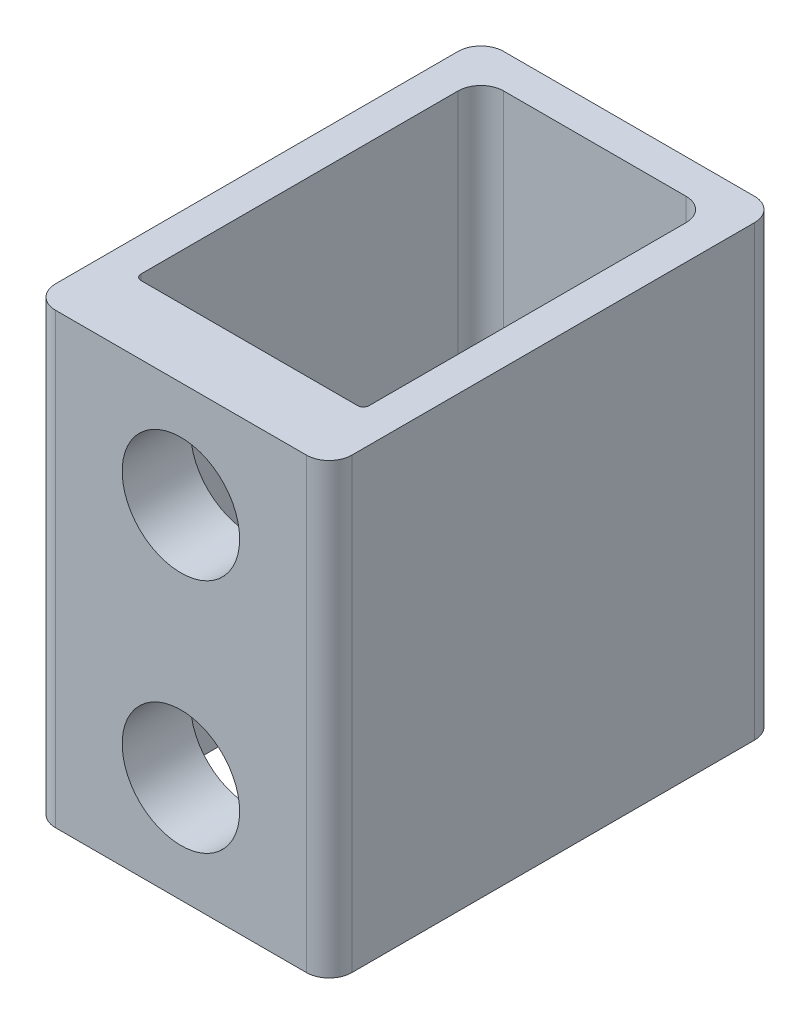
ISO-10303-21;
HEADER;
FILE_DESCRIPTION(('STEP AP214'),'2;1');
FILE_NAME('part.step','',(''),(''),'','','');
FILE_SCHEMA(('AUTOMOTIVE_DESIGN { 1 0 10303 214 1 1 1 1 }'));
ENDSEC;
DATA;
#1=APPLICATION_CONTEXT('core data for automotive mechanical design processes');
#2=APPLICATION_PROTOCOL_DEFINITION('international standard','automotive_design',2000,#1);
#3=PRODUCT_CONTEXT('',#1,'mechanical');
#4=PRODUCT('Part','Part','',(#3));
#5=PRODUCT_RELATED_PRODUCT_CATEGORY('part','',(#4));
#6=PRODUCT_DEFINITION_FORMATION('','',#4);
#7=PRODUCT_DEFINITION_CONTEXT('part definition',#1,'design');
#8=PRODUCT_DEFINITION('design','',#6,#7);
#9=PRODUCT_DEFINITION_SHAPE('','',#8);
#10=(LENGTH_UNIT() NAMED_UNIT(*) SI_UNIT(.MILLI.,.METRE.));
#11=(NAMED_UNIT(*) PLANE_ANGLE_UNIT() SI_UNIT($,.RADIAN.));
#12=(NAMED_UNIT(*) SI_UNIT($,.STERADIAN.) SOLID_ANGLE_UNIT());
#13=UNCERTAINTY_MEASURE_WITH_UNIT(LENGTH_MEASURE(1.E-05),#10,'distance_accuracy_value','');
#14=(GEOMETRIC_REPRESENTATION_CONTEXT(3) GLOBAL_UNCERTAINTY_ASSIGNED_CONTEXT((#13)) GLOBAL_UNIT_ASSIGNED_CONTEXT((#10,
#11,#12)) REPRESENTATION_CONTEXT('',''));
#15=CARTESIAN_POINT('',(0.,0.,0.));
#16=DIRECTION('',(0.,0.,1.));
#17=DIRECTION('',(1.,0.,0.));
#18=AXIS2_PLACEMENT_3D('',#15,#16,#17);
#19=CARTESIAN_POINT('',(5.5,-19.65,-8.825));
#20=DIRECTION('',(0.,1.,0.));
#21=DIRECTION('',(0.,0.,1.));
#22=AXIS2_PLACEMENT_3D('',#19,#20,#21);
#23=CYLINDRICAL_SURFACE('',#22,1.);
#24=CARTESIAN_POINT('',(5.5,0.,-8.825));
#25=DIRECTION('',(0.,1.,0.));
#26=DIRECTION('',(0.,0.,-1.));
#27=AXIS2_PLACEMENT_3D('',#24,#25,#26);
#28=CIRCLE('',#27,1.);
#29=CARTESIAN_POINT('',(6.5,0.,-8.82499999999999));
#30=VERTEX_POINT('',#29);
#31=CARTESIAN_POINT('',(5.49999999999999,0.,-9.825));
#32=VERTEX_POINT('',#31);
#33=EDGE_CURVE('E231',#30,#32,#28,.T.);
#34=ORIENTED_EDGE('',*,*,#33,.F.);
#35=DIRECTION('',(0.,1.,0.));
#36=VECTOR('',#35,1.);
#37=CARTESIAN_POINT('',(6.5,-19.65,-8.82499999999999));
#38=LINE('',#37,#36);
#39=CARTESIAN_POINT('',(6.5,-19.65,-8.82499999999999));
#40=VERTEX_POINT('',#39);
#41=EDGE_CURVE('E11',#40,#30,#38,.T.);
#42=ORIENTED_EDGE('',*,*,#41,.F.);
#43=CARTESIAN_POINT('',(5.5,-19.65,-8.825));
#44=DIRECTION('',(0.,1.,0.));
#45=DIRECTION('',(0.,0.,-1.));
#46=AXIS2_PLACEMENT_3D('',#43,#44,#45);
#47=CIRCLE('',#46,1.);
#48=CARTESIAN_POINT('',(5.49999999999999,-19.65,-9.825));
#49=VERTEX_POINT('',#48);
#50=EDGE_CURVE('E249',#40,#49,#47,.T.);
#51=ORIENTED_EDGE('',*,*,#50,.T.);
#52=DIRECTION('',(0.,1.,0.));
#53=VECTOR('',#52,1.);
#54=CARTESIAN_POINT('',(5.49999999999999,-19.65,-9.825));
#55=LINE('',#54,#53);
#56=EDGE_CURVE('E282',#49,#32,#55,.T.);
#57=ORIENTED_EDGE('',*,*,#56,.T.);
#58=EDGE_LOOP('',(#34,#42,#51,#57));
#59=FACE_BOUND('',#58,.T.);
#60=ADVANCED_FACE('F39',(#59),#23,.T.);
#61=CARTESIAN_POINT('',(6.5,-19.65,-8.82499999999999));
#62=DIRECTION('',(1.,0.,0.));
#63=DIRECTION('',(0.,0.,-1.));
#64=AXIS2_PLACEMENT_3D('',#61,#62,#63);
#65=PLANE('',#64);
#66=DIRECTION('',(0.,0.,-1.));
#67=VECTOR('',#66,1.);
#68=CARTESIAN_POINT('',(6.5,0.,-8.82499999999999));
#69=LINE('',#68,#67);
#70=CARTESIAN_POINT('',(6.5,0.,8.82499999999999));
#71=VERTEX_POINT('',#70);
#72=EDGE_CURVE('E254',#71,#30,#69,.T.);
#73=ORIENTED_EDGE('',*,*,#72,.F.);
#74=DIRECTION('',(0.,1.,0.));
#75=VECTOR('',#74,1.);
#76=CARTESIAN_POINT('',(6.5,-19.65,8.82499999999999));
#77=LINE('',#76,#75);
#78=CARTESIAN_POINT('',(6.5,-19.65,8.82499999999999));
#79=VERTEX_POINT('',#78);
#80=EDGE_CURVE('E48',#79,#71,#77,.T.);
#81=ORIENTED_EDGE('',*,*,#80,.F.);
#82=DIRECTION('',(0.,0.,-1.));
#83=VECTOR('',#82,1.);
#84=CARTESIAN_POINT('',(6.5,-19.65,-8.82499999999999));
#85=LINE('',#84,#83);
#86=EDGE_CURVE('E278',#79,#40,#85,.T.);
#87=ORIENTED_EDGE('',*,*,#86,.T.);
#88=ORIENTED_EDGE('',*,*,#41,.T.);
#89=EDGE_LOOP('',(#73,#81,#87,#88));
#90=FACE_BOUND('',#89,.T.);
#91=ADVANCED_FACE('F384',(#90),#65,.T.);
#92=CARTESIAN_POINT('',(5.5,-19.65,8.825));
#93=DIRECTION('',(0.,1.,0.));
#94=DIRECTION('',(0.,0.,1.));
#95=AXIS2_PLACEMENT_3D('',#92,#93,#94);
#96=CYLINDRICAL_SURFACE('',#95,1.);
#97=CARTESIAN_POINT('',(5.5,0.,8.825));
#98=DIRECTION('',(0.,1.,0.));
#99=DIRECTION('',(0.,0.,1.));
#100=AXIS2_PLACEMENT_3D('',#97,#98,#99);
#101=CIRCLE('',#100,1.);
#102=CARTESIAN_POINT('',(5.5,0.,9.825));
#103=VERTEX_POINT('',#102);
#104=EDGE_CURVE('E306',#103,#71,#101,.T.);
#105=ORIENTED_EDGE('',*,*,#104,.F.);
#106=DIRECTION('',(0.,1.,0.));
#107=VECTOR('',#106,1.);
#108=CARTESIAN_POINT('',(5.5,-19.65,9.825));
#109=LINE('',#108,#107);
#110=CARTESIAN_POINT('',(5.5,-19.65,9.825));
#111=VERTEX_POINT('',#110);
#112=EDGE_CURVE('E315',#111,#103,#109,.T.);
#113=ORIENTED_EDGE('',*,*,#112,.F.);
#114=CARTESIAN_POINT('',(5.5,-19.65,8.825));
#115=DIRECTION('',(0.,1.,0.));
#116=DIRECTION('',(0.,0.,1.));
#117=AXIS2_PLACEMENT_3D('',#114,#115,#116);
#118=CIRCLE('',#117,1.);
#119=EDGE_CURVE('E274',#111,#79,#118,.T.);
#120=ORIENTED_EDGE('',*,*,#119,.T.);
#121=ORIENTED_EDGE('',*,*,#80,.T.);
#122=EDGE_LOOP('',(#105,#113,#120,#121));
#123=FACE_BOUND('',#122,.T.);
#124=ADVANCED_FACE('F354',(#123),#96,.T.);
#125=CARTESIAN_POINT('',(-5.49999999999999,-19.65,9.825));
#126=DIRECTION('',(0.,0.,1.));
#127=DIRECTION('',(1.,0.,0.));
#128=AXIS2_PLACEMENT_3D('',#125,#126,#127);
#129=PLANE('',#128);
#130=CARTESIAN_POINT('',(0.,-4.65,9.825));
#131=DIRECTION('',(0.,0.,1.));
#132=DIRECTION('',(1.,0.,0.));
#133=AXIS2_PLACEMENT_3D('',#130,#131,#132);
#134=CIRCLE('',#133,2.575);
#135=CARTESIAN_POINT('',(2.575,-4.65,9.825));
#136=VERTEX_POINT('',#135);
#137=EDGE_CURVE('E334',#136,#136,#134,.T.);
#138=ORIENTED_EDGE('',*,*,#137,.F.);
#139=EDGE_LOOP('',(#138));
#140=FACE_BOUND('',#139,.T.);
#141=CARTESIAN_POINT('',(0.,-15.,9.825));
#142=DIRECTION('',(0.,0.,1.));
#143=DIRECTION('',(1.,0.,0.));
#144=AXIS2_PLACEMENT_3D('',#141,#142,#143);
#145=CIRCLE('',#144,2.575);
#146=CARTESIAN_POINT('',(2.575,-15.,9.825));
#147=VERTEX_POINT('',#146);
#148=EDGE_CURVE('E182',#147,#147,#145,.T.);
#149=ORIENTED_EDGE('',*,*,#148,.F.);
#150=EDGE_LOOP('',(#149));
#151=FACE_BOUND('',#150,.T.);
#152=DIRECTION('',(1.,0.,0.));
#153=VECTOR('',#152,1.);
#154=CARTESIAN_POINT('',(-5.49999999999999,0.,9.825));
#155=LINE('',#154,#153);
#156=CARTESIAN_POINT('',(-5.5,0.,9.825));
#157=VERTEX_POINT('',#156);
#158=EDGE_CURVE('E302',#157,#103,#155,.T.);
#159=ORIENTED_EDGE('',*,*,#158,.F.);
#160=DIRECTION('',(0.,1.,0.));
#161=VECTOR('',#160,1.);
#162=CARTESIAN_POINT('',(-5.5,-19.65,9.825));
#163=LINE('',#162,#161);
#164=CARTESIAN_POINT('',(-5.5,-19.65,9.825));
#165=VERTEX_POINT('',#164);
#166=EDGE_CURVE('E318',#165,#157,#163,.T.);
#167=ORIENTED_EDGE('',*,*,#166,.F.);
#168=DIRECTION('',(1.,0.,0.));
#169=VECTOR('',#168,1.);
#170=CARTESIAN_POINT('',(-5.49999999999999,-19.65,9.825));
#171=LINE('',#170,#169);
#172=EDGE_CURVE('E270',#165,#111,#171,.T.);
#173=ORIENTED_EDGE('',*,*,#172,.T.);
#174=ORIENTED_EDGE('',*,*,#112,.T.);
#175=EDGE_LOOP('',(#159,#167,#173,#174));
#176=FACE_BOUND('',#175,.T.);
#177=ADVANCED_FACE('F350',(#140,#151,#176),#129,.T.);
#178=CARTESIAN_POINT('',(-5.5,-19.65,8.825));
#179=DIRECTION('',(0.,1.,0.));
#180=DIRECTION('',(0.,0.,1.));
#181=AXIS2_PLACEMENT_3D('',#178,#179,#180);
#182=CYLINDRICAL_SURFACE('',#181,1.);
#183=CARTESIAN_POINT('',(-5.5,0.,8.825));
#184=DIRECTION('',(0.,1.,0.));
#185=DIRECTION('',(0.,0.,1.));
#186=AXIS2_PLACEMENT_3D('',#183,#184,#185);
#187=CIRCLE('',#186,1.);
#188=CARTESIAN_POINT('',(-6.5,0.,8.82499999999999));
#189=VERTEX_POINT('',#188);
#190=EDGE_CURVE('E298',#189,#157,#187,.T.);
#191=ORIENTED_EDGE('',*,*,#190,.F.);
#192=DIRECTION('',(0.,1.,0.));
#193=VECTOR('',#192,1.);
#194=CARTESIAN_POINT('',(-6.5,-19.65,8.82499999999999));
#195=LINE('',#194,#193);
#196=CARTESIAN_POINT('',(-6.5,-19.65,8.82499999999999));
#197=VERTEX_POINT('',#196);
#198=EDGE_CURVE('E321',#197,#189,#195,.T.);
#199=ORIENTED_EDGE('',*,*,#198,.F.);
#200=CARTESIAN_POINT('',(-5.5,-19.65,8.825));
#201=DIRECTION('',(0.,1.,0.));
#202=DIRECTION('',(0.,0.,1.));
#203=AXIS2_PLACEMENT_3D('',#200,#201,#202);
#204=CIRCLE('',#203,1.);
#205=EDGE_CURVE('E266',#197,#165,#204,.T.);
#206=ORIENTED_EDGE('',*,*,#205,.T.);
#207=ORIENTED_EDGE('',*,*,#166,.T.);
#208=EDGE_LOOP('',(#191,#199,#206,#207));
#209=FACE_BOUND('',#208,.T.);
#210=ADVANCED_FACE('F353',(#209),#182,.T.);
#211=CARTESIAN_POINT('',(-6.5,-19.65,-8.82499999999999));
#212=DIRECTION('',(-1.,0.,0.));
#213=DIRECTION('',(0.,0.,1.));
#214=AXIS2_PLACEMENT_3D('',#211,#212,#213);
#215=PLANE('',#214);
#216=DIRECTION('',(0.,0.,1.));
#217=VECTOR('',#216,1.);
#218=CARTESIAN_POINT('',(-6.5,0.,-8.82499999999999));
#219=LINE('',#218,#217);
#220=CARTESIAN_POINT('',(-6.5,0.,-8.82499999999999));
#221=VERTEX_POINT('',#220);
#222=EDGE_CURVE('E294',#221,#189,#219,.T.);
#223=ORIENTED_EDGE('',*,*,#222,.F.);
#224=DIRECTION('',(0.,1.,0.));
#225=VECTOR('',#224,1.);
#226=CARTESIAN_POINT('',(-6.5,-19.65,-8.82499999999999));
#227=LINE('',#226,#225);
#228=CARTESIAN_POINT('',(-6.5,-19.65,-8.82499999999999));
#229=VERTEX_POINT('',#228);
#230=EDGE_CURVE('E324',#229,#221,#227,.T.);
#231=ORIENTED_EDGE('',*,*,#230,.F.);
#232=DIRECTION('',(0.,0.,1.));
#233=VECTOR('',#232,1.);
#234=CARTESIAN_POINT('',(-6.5,-19.65,-8.82499999999999));
#235=LINE('',#234,#233);
#236=EDGE_CURVE('E262',#229,#197,#235,.T.);
#237=ORIENTED_EDGE('',*,*,#236,.T.);
#238=ORIENTED_EDGE('',*,*,#198,.T.);
#239=EDGE_LOOP('',(#223,#231,#237,#238));
#240=FACE_BOUND('',#239,.T.);
#241=ADVANCED_FACE('F371',(#240),#215,.T.);
#242=CARTESIAN_POINT('',(-5.5,-19.65,-8.825));
#243=DIRECTION('',(0.,1.,0.));
#244=DIRECTION('',(0.,0.,1.));
#245=AXIS2_PLACEMENT_3D('',#242,#243,#244);
#246=CYLINDRICAL_SURFACE('',#245,1.);
#247=CARTESIAN_POINT('',(-5.5,0.,-8.825));
#248=DIRECTION('',(0.,1.,0.));
#249=DIRECTION('',(0.,0.,1.));
#250=AXIS2_PLACEMENT_3D('',#247,#248,#249);
#251=CIRCLE('',#250,1.);
#252=CARTESIAN_POINT('',(-5.49999999999999,0.,-9.825));
#253=VERTEX_POINT('',#252);
#254=EDGE_CURVE('E290',#253,#221,#251,.T.);
#255=ORIENTED_EDGE('',*,*,#254,.F.);
#256=DIRECTION('',(0.,1.,0.));
#257=VECTOR('',#256,1.);
#258=CARTESIAN_POINT('',(-5.49999999999999,-19.65,-9.825));
#259=LINE('',#258,#257);
#260=CARTESIAN_POINT('',(-5.49999999999999,-19.65,-9.825));
#261=VERTEX_POINT('',#260);
#262=EDGE_CURVE('E327',#261,#253,#259,.T.);
#263=ORIENTED_EDGE('',*,*,#262,.F.);
#264=CARTESIAN_POINT('',(-5.5,-19.65,-8.825));
#265=DIRECTION('',(0.,1.,0.));
#266=DIRECTION('',(0.,0.,1.));
#267=AXIS2_PLACEMENT_3D('',#264,#265,#266);
#268=CIRCLE('',#267,1.);
#269=EDGE_CURVE('E258',#261,#229,#268,.T.);
#270=ORIENTED_EDGE('',*,*,#269,.T.);
#271=ORIENTED_EDGE('',*,*,#230,.T.);
#272=EDGE_LOOP('',(#255,#263,#270,#271));
#273=FACE_BOUND('',#272,.T.);
#274=ADVANCED_FACE('F374',(#273),#246,.T.);
#275=CARTESIAN_POINT('',(-5.49999999999999,-19.65,-9.825));
#276=DIRECTION('',(0.,0.,-1.));
#277=DIRECTION('',(-1.,0.,0.));
#278=AXIS2_PLACEMENT_3D('',#275,#276,#277);
#279=PLANE('',#278);
#280=DIRECTION('',(-1.,0.,0.));
#281=VECTOR('',#280,1.);
#282=CARTESIAN_POINT('',(-5.49999999999999,0.,-9.825));
#283=LINE('',#282,#281);
#284=EDGE_CURVE('E286',#32,#253,#283,.T.);
#285=ORIENTED_EDGE('',*,*,#284,.F.);
#286=ORIENTED_EDGE('',*,*,#56,.F.);
#287=DIRECTION('',(-1.,0.,0.));
#288=VECTOR('',#287,1.);
#289=CARTESIAN_POINT('',(-5.49999999999999,-19.65,-9.825));
#290=LINE('',#289,#288);
#291=EDGE_CURVE('E253',#49,#261,#290,.T.);
#292=ORIENTED_EDGE('',*,*,#291,.T.);
#293=ORIENTED_EDGE('',*,*,#262,.T.);
#294=EDGE_LOOP('',(#285,#286,#292,#293));
#295=FACE_BOUND('',#294,.T.);
#296=ADVANCED_FACE('F378',(#295),#279,.T.);
#297=CARTESIAN_POINT('',(5.5,-19.65,-8.825));
#298=DIRECTION('',(0.,-1.,0.));
#299=DIRECTION('',(0.,0.,-1.));
#300=AXIS2_PLACEMENT_3D('',#297,#298,#299);
#301=PLANE('',#300);
#302=CARTESIAN_POINT('',(4.75,-19.65,6.575));
#303=DIRECTION('',(0.,1.,0.));
#304=DIRECTION('',(0.,0.,1.));
#305=AXIS2_PLACEMENT_3D('',#302,#303,#304);
#306=CIRCLE('',#305,0.25);
#307=CARTESIAN_POINT('',(4.75,-19.65,6.825));
#308=VERTEX_POINT('',#307);
#309=CARTESIAN_POINT('',(5.,-19.65,6.575));
#310=VERTEX_POINT('',#309);
#311=EDGE_CURVE('E155',#308,#310,#306,.T.);
#312=ORIENTED_EDGE('',*,*,#311,.T.);
#313=DIRECTION('',(0.,0.,-1.));
#314=VECTOR('',#313,1.);
#315=CARTESIAN_POINT('',(5.,-19.65,-7.325));
#316=LINE('',#315,#314);
#317=CARTESIAN_POINT('',(5.,-19.65,-7.325));
#318=VERTEX_POINT('',#317);
#319=EDGE_CURVE('E165',#310,#318,#316,.T.);
#320=ORIENTED_EDGE('',*,*,#319,.T.);
#321=CARTESIAN_POINT('',(4.,-19.65,-7.325));
#322=DIRECTION('',(0.,1.,0.));
#323=DIRECTION('',(0.,0.,-1.));
#324=AXIS2_PLACEMENT_3D('',#321,#322,#323);
#325=CIRCLE('',#324,1.);
#326=CARTESIAN_POINT('',(4.,-19.65,-8.325));
#327=VERTEX_POINT('',#326);
#328=EDGE_CURVE('E56',#318,#327,#325,.T.);
#329=ORIENTED_EDGE('',*,*,#328,.T.);
#330=DIRECTION('',(-1.,0.,0.));
#331=VECTOR('',#330,1.);
#332=CARTESIAN_POINT('',(-4.,-19.65,-8.325));
#333=LINE('',#332,#331);
#334=CARTESIAN_POINT('',(-4.,-19.65,-8.325));
#335=VERTEX_POINT('',#334);
#336=EDGE_CURVE('E187',#327,#335,#333,.T.);
#337=ORIENTED_EDGE('',*,*,#336,.T.);
#338=CARTESIAN_POINT('',(-4.,-19.65,-7.325));
#339=DIRECTION('',(0.,1.,0.));
#340=DIRECTION('',(0.,0.,1.));
#341=AXIS2_PLACEMENT_3D('',#338,#339,#340);
#342=CIRCLE('',#341,1.);
#343=CARTESIAN_POINT('',(-5.,-19.65,-7.325));
#344=VERTEX_POINT('',#343);
#345=EDGE_CURVE('E191',#335,#344,#342,.T.);
#346=ORIENTED_EDGE('',*,*,#345,.T.);
#347=DIRECTION('',(0.,0.,1.));
#348=VECTOR('',#347,1.);
#349=CARTESIAN_POINT('',(-5.,-19.65,-7.325));
#350=LINE('',#349,#348);
#351=CARTESIAN_POINT('',(-5.,-19.65,6.575));
#352=VERTEX_POINT('',#351);
#353=EDGE_CURVE('E195',#344,#352,#350,.T.);
#354=ORIENTED_EDGE('',*,*,#353,.T.);
#355=CARTESIAN_POINT('',(-4.75,-19.65,6.575));
#356=DIRECTION('',(0.,1.,0.));
#357=DIRECTION('',(0.,0.,-1.));
#358=AXIS2_PLACEMENT_3D('',#355,#356,#357);
#359=CIRCLE('',#358,0.25);
#360=CARTESIAN_POINT('',(-4.75,-19.65,6.825));
#361=VERTEX_POINT('',#360);
#362=EDGE_CURVE('E199',#352,#361,#359,.T.);
#363=ORIENTED_EDGE('',*,*,#362,.T.);
#364=DIRECTION('',(1.,0.,0.));
#365=VECTOR('',#364,1.);
#366=CARTESIAN_POINT('',(-4.75,-19.65,6.825));
#367=LINE('',#366,#365);
#368=EDGE_CURVE('E162',#361,#308,#367,.T.);
#369=ORIENTED_EDGE('',*,*,#368,.T.);
#370=EDGE_LOOP('',(#312,#320,#329,#337,#346,#354,#363,#369));
#371=FACE_BOUND('',#370,.T.);
#372=ORIENTED_EDGE('',*,*,#50,.F.);
#373=ORIENTED_EDGE('',*,*,#86,.F.);
#374=ORIENTED_EDGE('',*,*,#119,.F.);
#375=ORIENTED_EDGE('',*,*,#172,.F.);
#376=ORIENTED_EDGE('',*,*,#205,.F.);
#377=ORIENTED_EDGE('',*,*,#236,.F.);
#378=ORIENTED_EDGE('',*,*,#269,.F.);
#379=ORIENTED_EDGE('',*,*,#291,.F.);
#380=EDGE_LOOP('',(#372,#373,#374,#375,#376,#377,#378,#379));
#381=FACE_BOUND('',#380,.T.);
#382=ADVANCED_FACE('F170',(#371,#381),#301,.T.);
#383=CARTESIAN_POINT('',(5.5,0.,-8.825));
#384=DIRECTION('',(0.,-1.,0.));
#385=DIRECTION('',(0.,0.,-1.));
#386=AXIS2_PLACEMENT_3D('',#383,#384,#385);
#387=PLANE('',#386);
#388=DIRECTION('',(0.,0.,-1.));
#389=VECTOR('',#388,1.);
#390=CARTESIAN_POINT('',(5.,0.,-7.325));
#391=LINE('',#390,#389);
#392=CARTESIAN_POINT('',(5.,0.,6.575));
#393=VERTEX_POINT('',#392);
#394=CARTESIAN_POINT('',(5.,0.,-7.325));
#395=VERTEX_POINT('',#394);
#396=EDGE_CURVE('E206',#393,#395,#391,.T.);
#397=ORIENTED_EDGE('',*,*,#396,.F.);
#398=CARTESIAN_POINT('',(4.75,0.,6.575));
#399=DIRECTION('',(0.,1.,0.));
#400=DIRECTION('',(0.,0.,1.));
#401=AXIS2_PLACEMENT_3D('',#398,#399,#400);
#402=CIRCLE('',#401,0.25);
#403=CARTESIAN_POINT('',(4.75,0.,6.825));
#404=VERTEX_POINT('',#403);
#405=EDGE_CURVE('E64',#404,#393,#402,.T.);
#406=ORIENTED_EDGE('',*,*,#405,.F.);
#407=DIRECTION('',(1.,0.,0.));
#408=VECTOR('',#407,1.);
#409=CARTESIAN_POINT('',(-4.75,0.,6.825));
#410=LINE('',#409,#408);
#411=CARTESIAN_POINT('',(-4.75,0.,6.825));
#412=VERTEX_POINT('',#411);
#413=EDGE_CURVE('E175',#412,#404,#410,.T.);
#414=ORIENTED_EDGE('',*,*,#413,.F.);
#415=CARTESIAN_POINT('',(-4.75,0.,6.575));
#416=DIRECTION('',(0.,1.,0.));
#417=DIRECTION('',(0.,0.,-1.));
#418=AXIS2_PLACEMENT_3D('',#415,#416,#417);
#419=CIRCLE('',#418,0.25);
#420=CARTESIAN_POINT('',(-5.,0.,6.575));
#421=VERTEX_POINT('',#420);
#422=EDGE_CURVE('E179',#421,#412,#419,.T.);
#423=ORIENTED_EDGE('',*,*,#422,.F.);
#424=DIRECTION('',(0.,0.,1.));
#425=VECTOR('',#424,1.);
#426=CARTESIAN_POINT('',(-5.,0.,-7.325));
#427=LINE('',#426,#425);
#428=CARTESIAN_POINT('',(-5.,0.,-7.325));
#429=VERTEX_POINT('',#428);
#430=EDGE_CURVE('E221',#429,#421,#427,.T.);
#431=ORIENTED_EDGE('',*,*,#430,.F.);
#432=CARTESIAN_POINT('',(-4.,0.,-7.325));
#433=DIRECTION('',(0.,1.,0.));
#434=DIRECTION('',(0.,0.,1.));
#435=AXIS2_PLACEMENT_3D('',#432,#433,#434);
#436=CIRCLE('',#435,1.);
#437=CARTESIAN_POINT('',(-4.,0.,-8.325));
#438=VERTEX_POINT('',#437);
#439=EDGE_CURVE('E217',#438,#429,#436,.T.);
#440=ORIENTED_EDGE('',*,*,#439,.F.);
#441=DIRECTION('',(-1.,0.,0.));
#442=VECTOR('',#441,1.);
#443=CARTESIAN_POINT('',(-4.,0.,-8.325));
#444=LINE('',#443,#442);
#445=CARTESIAN_POINT('',(4.,0.,-8.325));
#446=VERTEX_POINT('',#445);
#447=EDGE_CURVE('E213',#446,#438,#444,.T.);
#448=ORIENTED_EDGE('',*,*,#447,.F.);
#449=CARTESIAN_POINT('',(4.,0.,-7.325));
#450=DIRECTION('',(0.,1.,0.));
#451=DIRECTION('',(0.,0.,-1.));
#452=AXIS2_PLACEMENT_3D('',#449,#450,#451);
#453=CIRCLE('',#452,1.);
#454=EDGE_CURVE('E209',#395,#446,#453,.T.);
#455=ORIENTED_EDGE('',*,*,#454,.F.);
#456=EDGE_LOOP('',(#397,#406,#414,#423,#431,#440,#448,#455));
#457=FACE_BOUND('',#456,.T.);
#458=ORIENTED_EDGE('',*,*,#33,.T.);
#459=ORIENTED_EDGE('',*,*,#284,.T.);
#460=ORIENTED_EDGE('',*,*,#254,.T.);
#461=ORIENTED_EDGE('',*,*,#222,.T.);
#462=ORIENTED_EDGE('',*,*,#190,.T.);
#463=ORIENTED_EDGE('',*,*,#158,.T.);
#464=ORIENTED_EDGE('',*,*,#104,.T.);
#465=ORIENTED_EDGE('',*,*,#72,.T.);
#466=EDGE_LOOP('',(#458,#459,#460,#461,#462,#463,#464,#465));
#467=FACE_BOUND('',#466,.T.);
#468=ADVANCED_FACE('F362',(#457,#467),#387,.F.);
#469=CARTESIAN_POINT('',(4.75,-19.65,6.575));
#470=DIRECTION('',(0.,1.,0.));
#471=DIRECTION('',(0.,0.,1.));
#472=AXIS2_PLACEMENT_3D('',#469,#470,#471);
#473=CYLINDRICAL_SURFACE('',#472,0.25);
#474=ORIENTED_EDGE('',*,*,#405,.T.);
#475=DIRECTION('',(0.,1.,0.));
#476=VECTOR('',#475,1.);
#477=CARTESIAN_POINT('',(5.,-19.65,6.575));
#478=LINE('',#477,#476);
#479=EDGE_CURVE('E151',#310,#393,#478,.T.);
#480=ORIENTED_EDGE('',*,*,#479,.F.);
#481=ORIENTED_EDGE('',*,*,#311,.F.);
#482=DIRECTION('',(0.,1.,0.));
#483=VECTOR('',#482,1.);
#484=CARTESIAN_POINT('',(4.75,-19.65,6.825));
#485=LINE('',#484,#483);
#486=EDGE_CURVE('E228',#308,#404,#485,.T.);
#487=ORIENTED_EDGE('',*,*,#486,.T.);
#488=EDGE_LOOP('',(#474,#480,#481,#487));
#489=FACE_BOUND('',#488,.T.);
#490=ADVANCED_FACE('F153',(#489),#473,.F.);
#491=CARTESIAN_POINT('',(-4.75,-19.65,6.825));
#492=DIRECTION('',(0.,0.,1.));
#493=DIRECTION('',(1.,0.,0.));
#494=AXIS2_PLACEMENT_3D('',#491,#492,#493);
#495=PLANE('',#494);
#496=CARTESIAN_POINT('',(0.,-4.65,6.825));
#497=DIRECTION('',(0.,0.,1.));
#498=DIRECTION('',(1.,0.,0.));
#499=AXIS2_PLACEMENT_3D('',#496,#497,#498);
#500=CIRCLE('',#499,2.575);
#501=CARTESIAN_POINT('',(2.575,-4.65,6.825));
#502=VERTEX_POINT('',#501);
#503=EDGE_CURVE('E42',#502,#502,#500,.T.);
#504=ORIENTED_EDGE('',*,*,#503,.T.);
#505=EDGE_LOOP('',(#504));
#506=FACE_BOUND('',#505,.T.);
#507=CARTESIAN_POINT('',(0.,-15.,6.825));
#508=DIRECTION('',(0.,0.,1.));
#509=DIRECTION('',(1.,0.,0.));
#510=AXIS2_PLACEMENT_3D('',#507,#508,#509);
#511=CIRCLE('',#510,2.575);
#512=CARTESIAN_POINT('',(2.575,-15.,6.825));
#513=VERTEX_POINT('',#512);
#514=EDGE_CURVE('E331',#513,#513,#511,.T.);
#515=ORIENTED_EDGE('',*,*,#514,.T.);
#516=EDGE_LOOP('',(#515));
#517=FACE_BOUND('',#516,.T.);
#518=ORIENTED_EDGE('',*,*,#413,.T.);
#519=ORIENTED_EDGE('',*,*,#486,.F.);
#520=ORIENTED_EDGE('',*,*,#368,.F.);
#521=DIRECTION('',(0.,1.,0.));
#522=VECTOR('',#521,1.);
#523=CARTESIAN_POINT('',(-4.75,-19.65,6.825));
#524=LINE('',#523,#522);
#525=EDGE_CURVE('E232',#361,#412,#524,.T.);
#526=ORIENTED_EDGE('',*,*,#525,.T.);
#527=EDGE_LOOP('',(#518,#519,#520,#526));
#528=FACE_BOUND('',#527,.T.);
#529=ADVANCED_FACE('F461',(#506,#517,#528),#495,.F.);
#530=CARTESIAN_POINT('',(-4.75,-19.65,6.575));
#531=DIRECTION('',(0.,1.,0.));
#532=DIRECTION('',(0.,0.,1.));
#533=AXIS2_PLACEMENT_3D('',#530,#531,#532);
#534=CYLINDRICAL_SURFACE('',#533,0.25);
#535=ORIENTED_EDGE('',*,*,#422,.T.);
#536=ORIENTED_EDGE('',*,*,#525,.F.);
#537=ORIENTED_EDGE('',*,*,#362,.F.);
#538=DIRECTION('',(0.,1.,0.));
#539=VECTOR('',#538,1.);
#540=CARTESIAN_POINT('',(-5.,-19.65,6.575));
#541=LINE('',#540,#539);
#542=EDGE_CURVE('E235',#352,#421,#541,.T.);
#543=ORIENTED_EDGE('',*,*,#542,.T.);
#544=EDGE_LOOP('',(#535,#536,#537,#543));
#545=FACE_BOUND('',#544,.T.);
#546=ADVANCED_FACE('F468',(#545),#534,.F.);
#547=CARTESIAN_POINT('',(-5.,-19.65,-7.325));
#548=DIRECTION('',(-1.,0.,0.));
#549=DIRECTION('',(0.,0.,1.));
#550=AXIS2_PLACEMENT_3D('',#547,#548,#549);
#551=PLANE('',#550);
#552=ORIENTED_EDGE('',*,*,#430,.T.);
#553=ORIENTED_EDGE('',*,*,#542,.F.);
#554=ORIENTED_EDGE('',*,*,#353,.F.);
#555=DIRECTION('',(0.,1.,0.));
#556=VECTOR('',#555,1.);
#557=CARTESIAN_POINT('',(-5.,-19.65,-7.325));
#558=LINE('',#557,#556);
#559=EDGE_CURVE('E238',#344,#429,#558,.T.);
#560=ORIENTED_EDGE('',*,*,#559,.T.);
#561=EDGE_LOOP('',(#552,#553,#554,#560));
#562=FACE_BOUND('',#561,.T.);
#563=ADVANCED_FACE('F473',(#562),#551,.F.);
#564=CARTESIAN_POINT('',(-4.,-19.65,-7.325));
#565=DIRECTION('',(0.,1.,0.));
#566=DIRECTION('',(0.,0.,1.));
#567=AXIS2_PLACEMENT_3D('',#564,#565,#566);
#568=CYLINDRICAL_SURFACE('',#567,1.);
#569=ORIENTED_EDGE('',*,*,#439,.T.);
#570=ORIENTED_EDGE('',*,*,#559,.F.);
#571=ORIENTED_EDGE('',*,*,#345,.F.);
#572=DIRECTION('',(0.,1.,0.));
#573=VECTOR('',#572,1.);
#574=CARTESIAN_POINT('',(-4.,-19.65,-8.325));
#575=LINE('',#574,#573);
#576=EDGE_CURVE('E241',#335,#438,#575,.T.);
#577=ORIENTED_EDGE('',*,*,#576,.T.);
#578=EDGE_LOOP('',(#569,#570,#571,#577));
#579=FACE_BOUND('',#578,.T.);
#580=ADVANCED_FACE('F483',(#579),#568,.F.);
#581=CARTESIAN_POINT('',(-4.,-19.65,-8.325));
#582=DIRECTION('',(0.,0.,-1.));
#583=DIRECTION('',(-1.,0.,0.));
#584=AXIS2_PLACEMENT_3D('',#581,#582,#583);
#585=PLANE('',#584);
#586=ORIENTED_EDGE('',*,*,#447,.T.);
#587=ORIENTED_EDGE('',*,*,#576,.F.);
#588=ORIENTED_EDGE('',*,*,#336,.F.);
#589=DIRECTION('',(0.,1.,0.));
#590=VECTOR('',#589,1.);
#591=CARTESIAN_POINT('',(4.,-19.65,-8.325));
#592=LINE('',#591,#590);
#593=EDGE_CURVE('E244',#327,#446,#592,.T.);
#594=ORIENTED_EDGE('',*,*,#593,.T.);
#595=EDGE_LOOP('',(#586,#587,#588,#594));
#596=FACE_BOUND('',#595,.T.);
#597=ADVANCED_FACE('F493',(#596),#585,.F.);
#598=CARTESIAN_POINT('',(4.,-19.65,-7.325));
#599=DIRECTION('',(0.,1.,0.));
#600=DIRECTION('',(0.,0.,1.));
#601=AXIS2_PLACEMENT_3D('',#598,#599,#600);
#602=CYLINDRICAL_SURFACE('',#601,1.);
#603=ORIENTED_EDGE('',*,*,#454,.T.);
#604=ORIENTED_EDGE('',*,*,#593,.F.);
#605=ORIENTED_EDGE('',*,*,#328,.F.);
#606=DIRECTION('',(0.,1.,0.));
#607=VECTOR('',#606,1.);
#608=CARTESIAN_POINT('',(5.,-19.65,-7.325));
#609=LINE('',#608,#607);
#610=EDGE_CURVE('E161',#318,#395,#609,.T.);
#611=ORIENTED_EDGE('',*,*,#610,.T.);
#612=EDGE_LOOP('',(#603,#604,#605,#611));
#613=FACE_BOUND('',#612,.T.);
#614=ADVANCED_FACE('F503',(#613),#602,.F.);
#615=CARTESIAN_POINT('',(5.,-19.65,-7.325));
#616=DIRECTION('',(1.,0.,0.));
#617=DIRECTION('',(0.,0.,-1.));
#618=AXIS2_PLACEMENT_3D('',#615,#616,#617);
#619=PLANE('',#618);
#620=ORIENTED_EDGE('',*,*,#396,.T.);
#621=ORIENTED_EDGE('',*,*,#610,.F.);
#622=ORIENTED_EDGE('',*,*,#319,.F.);
#623=ORIENTED_EDGE('',*,*,#479,.T.);
#624=EDGE_LOOP('',(#620,#621,#622,#623));
#625=FACE_BOUND('',#624,.T.);
#626=ADVANCED_FACE('F166',(#625),#619,.F.);
#627=CARTESIAN_POINT('',(0.,-15.,1.17500000000001));
#628=DIRECTION('',(0.,0.,1.));
#629=DIRECTION('',(1.,0.,0.));
#630=AXIS2_PLACEMENT_3D('',#627,#628,#629);
#631=CYLINDRICAL_SURFACE('',#630,2.575);
#632=ORIENTED_EDGE('',*,*,#148,.T.);
#633=EDGE_LOOP('',(#632));
#634=FACE_BOUND('',#633,.T.);
#635=ORIENTED_EDGE('',*,*,#514,.F.);
#636=EDGE_LOOP('',(#635));
#637=FACE_BOUND('',#636,.T.);
#638=ADVANCED_FACE('F347',(#634,#637),#631,.F.);
#639=CARTESIAN_POINT('',(0.,-4.65,1.17500000000001));
#640=DIRECTION('',(0.,0.,1.));
#641=DIRECTION('',(1.,0.,0.));
#642=AXIS2_PLACEMENT_3D('',#639,#640,#641);
#643=CYLINDRICAL_SURFACE('',#642,2.575);
#644=ORIENTED_EDGE('',*,*,#137,.T.);
#645=EDGE_LOOP('',(#644));
#646=FACE_BOUND('',#645,.T.);
#647=ORIENTED_EDGE('',*,*,#503,.F.);
#648=EDGE_LOOP('',(#647));
#649=FACE_BOUND('',#648,.T.);
#650=ADVANCED_FACE('F541',(#646,#649),#643,.F.);
#651=CLOSED_SHELL('',(#60,#91,#124,#177,#210,#241,#274,#296,#382,#468,#490,#529,#546,#563,#580,
#597,#614,#626,#638,#650));
#652=MANIFOLD_SOLID_BREP('B2',#651);
#653=ADVANCED_BREP_SHAPE_REPRESENTATION('',(#18,#652),#14);
#654=SHAPE_DEFINITION_REPRESENTATION(#9,#653);
ENDSEC;
END-ISO-10303-21;
